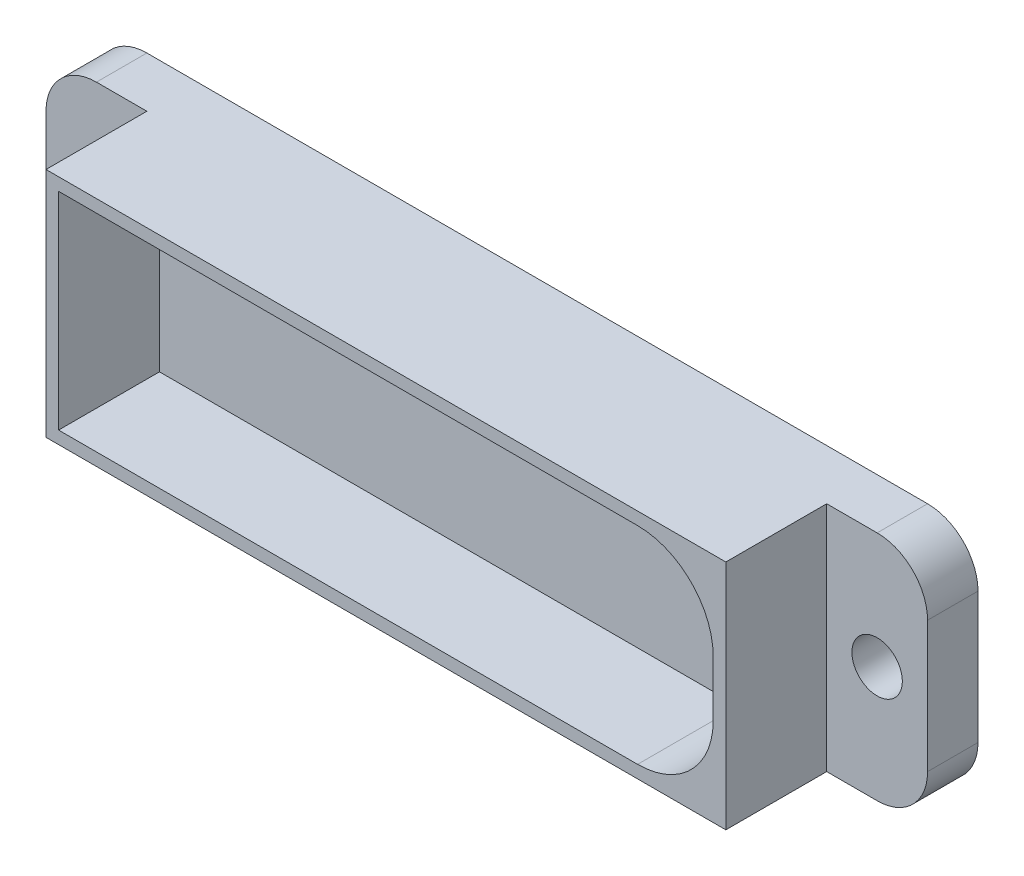
ISO-10303-21;
HEADER;
FILE_DESCRIPTION(('STEP AP214'),'2;1');
FILE_NAME('part.step','',(''),(''),'','','');
FILE_SCHEMA(('AUTOMOTIVE_DESIGN { 1 0 10303 214 1 1 1 1 }'));
ENDSEC;
DATA;
#1=APPLICATION_CONTEXT('core data for automotive mechanical design processes');
#2=APPLICATION_PROTOCOL_DEFINITION('international standard','automotive_design',2000,#1);
#3=PRODUCT_CONTEXT('',#1,'mechanical');
#4=PRODUCT('Part','Part','',(#3));
#5=PRODUCT_RELATED_PRODUCT_CATEGORY('part','',(#4));
#6=PRODUCT_DEFINITION_FORMATION('','',#4);
#7=PRODUCT_DEFINITION_CONTEXT('part definition',#1,'design');
#8=PRODUCT_DEFINITION('design','',#6,#7);
#9=PRODUCT_DEFINITION_SHAPE('','',#8);
#10=(LENGTH_UNIT() NAMED_UNIT(*) SI_UNIT(.MILLI.,.METRE.));
#11=(NAMED_UNIT(*) PLANE_ANGLE_UNIT() SI_UNIT($,.RADIAN.));
#12=(NAMED_UNIT(*) SI_UNIT($,.STERADIAN.) SOLID_ANGLE_UNIT());
#13=UNCERTAINTY_MEASURE_WITH_UNIT(LENGTH_MEASURE(1.E-05),#10,'distance_accuracy_value','');
#14=(GEOMETRIC_REPRESENTATION_CONTEXT(3) GLOBAL_UNCERTAINTY_ASSIGNED_CONTEXT((#13)) GLOBAL_UNIT_ASSIGNED_CONTEXT((#10,
#11,#12)) REPRESENTATION_CONTEXT('',''));
#15=CARTESIAN_POINT('',(0.,0.,0.));
#16=DIRECTION('',(0.,0.,1.));
#17=DIRECTION('',(1.,0.,0.));
#18=AXIS2_PLACEMENT_3D('',#15,#16,#17);
#19=CARTESIAN_POINT('',(15.48,2.6,2.));
#20=DIRECTION('',(0.,0.,-1.));
#21=DIRECTION('',(-1.,0.,0.));
#22=AXIS2_PLACEMENT_3D('',#19,#20,#21);
#23=PLANE('',#22);
#24=DIRECTION('',(0.,1.,0.));
#25=VECTOR('',#24,1.);
#26=CARTESIAN_POINT('',(13.48,2.6,2.));
#27=LINE('',#26,#25);
#28=CARTESIAN_POINT('',(13.48,-4.6,2.));
#29=VERTEX_POINT('',#28);
#30=CARTESIAN_POINT('',(13.48,4.6,2.));
#31=VERTEX_POINT('',#30);
#32=EDGE_CURVE('E226',#29,#31,#27,.T.);
#33=ORIENTED_EDGE('',*,*,#32,.F.);
#34=DIRECTION('',(1.,0.,0.));
#35=VECTOR('',#34,1.);
#36=CARTESIAN_POINT('',(-15.48,-4.6,2.));
#37=LINE('',#36,#35);
#38=CARTESIAN_POINT('',(15.48,-4.6,2.));
#39=VERTEX_POINT('',#38);
#40=EDGE_CURVE('E270',#29,#39,#37,.T.);
#41=ORIENTED_EDGE('',*,*,#40,.T.);
#42=CARTESIAN_POINT('',(15.48,-2.6,2.));
#43=DIRECTION('',(0.,0.,1.));
#44=DIRECTION('',(1.,0.,0.));
#45=AXIS2_PLACEMENT_3D('',#42,#43,#44);
#46=CIRCLE('',#45,2.);
#47=CARTESIAN_POINT('',(17.48,-2.6,2.));
#48=VERTEX_POINT('',#47);
#49=EDGE_CURVE('E273',#39,#48,#46,.T.);
#50=ORIENTED_EDGE('',*,*,#49,.T.);
#51=DIRECTION('',(0.,1.,0.));
#52=VECTOR('',#51,1.);
#53=CARTESIAN_POINT('',(17.48,-2.59999999999999,2.));
#54=LINE('',#53,#52);
#55=CARTESIAN_POINT('',(17.48,2.59999999999999,2.));
#56=VERTEX_POINT('',#55);
#57=EDGE_CURVE('E275',#48,#56,#54,.T.);
#58=ORIENTED_EDGE('',*,*,#57,.T.);
#59=CARTESIAN_POINT('',(15.48,2.6,2.));
#60=DIRECTION('',(0.,0.,1.));
#61=DIRECTION('',(-1.,0.,0.));
#62=AXIS2_PLACEMENT_3D('',#59,#60,#61);
#63=CIRCLE('',#62,2.);
#64=CARTESIAN_POINT('',(15.48,4.6,2.));
#65=VERTEX_POINT('',#64);
#66=EDGE_CURVE('E257',#56,#65,#63,.T.);
#67=ORIENTED_EDGE('',*,*,#66,.T.);
#68=DIRECTION('',(-1.,0.,0.));
#69=VECTOR('',#68,1.);
#70=CARTESIAN_POINT('',(-15.48,4.6,2.));
#71=LINE('',#70,#69);
#72=EDGE_CURVE('E262',#65,#31,#71,.T.);
#73=ORIENTED_EDGE('',*,*,#72,.T.);
#74=EDGE_LOOP('',(#33,#41,#50,#58,#67,#73));
#75=FACE_BOUND('',#74,.T.);
#76=CARTESIAN_POINT('',(15.48,0.,2.));
#77=DIRECTION('',(0.,0.,1.));
#78=DIRECTION('',(1.,0.,0.));
#79=AXIS2_PLACEMENT_3D('',#76,#77,#78);
#80=CIRCLE('',#79,1.);
#81=CARTESIAN_POINT('',(16.48,0.,2.));
#82=VERTEX_POINT('',#81);
#83=EDGE_CURVE('E245',#82,#82,#80,.T.);
#84=ORIENTED_EDGE('',*,*,#83,.F.);
#85=EDGE_LOOP('',(#84));
#86=FACE_BOUND('',#85,.T.);
#87=ADVANCED_FACE('F36',(#75,#86),#23,.F.);
#88=DIRECTION('',(0.,-1.,0.));
#89=VECTOR('',#88,1.);
#90=CARTESIAN_POINT('',(-13.48,2.6,2.));
#91=LINE('',#90,#89);
#92=CARTESIAN_POINT('',(-13.48,4.6,2.));
#93=VERTEX_POINT('',#92);
#94=CARTESIAN_POINT('',(-13.48,-4.6,2.));
#95=VERTEX_POINT('',#94);
#96=EDGE_CURVE('E59',#93,#95,#91,.T.);
#97=ORIENTED_EDGE('',*,*,#96,.F.);
#98=CARTESIAN_POINT('',(-15.48,4.6,2.));
#99=VERTEX_POINT('',#98);
#100=EDGE_CURVE('E260',#93,#99,#71,.T.);
#101=ORIENTED_EDGE('',*,*,#100,.T.);
#102=CARTESIAN_POINT('',(-15.48,2.6,2.));
#103=DIRECTION('',(0.,0.,1.));
#104=DIRECTION('',(-1.,0.,0.));
#105=AXIS2_PLACEMENT_3D('',#102,#103,#104);
#106=CIRCLE('',#105,2.);
#107=CARTESIAN_POINT('',(-17.48,2.59999999999999,2.));
#108=VERTEX_POINT('',#107);
#109=EDGE_CURVE('E264',#99,#108,#106,.T.);
#110=ORIENTED_EDGE('',*,*,#109,.T.);
#111=DIRECTION('',(0.,-1.,0.));
#112=VECTOR('',#111,1.);
#113=CARTESIAN_POINT('',(-17.48,-2.59999999999999,2.));
#114=LINE('',#113,#112);
#115=CARTESIAN_POINT('',(-17.48,-2.59999999999999,2.));
#116=VERTEX_POINT('',#115);
#117=EDGE_CURVE('E266',#108,#116,#114,.T.);
#118=ORIENTED_EDGE('',*,*,#117,.T.);
#119=CARTESIAN_POINT('',(-15.48,-2.6,2.));
#120=DIRECTION('',(0.,0.,1.));
#121=DIRECTION('',(-1.,0.,0.));
#122=AXIS2_PLACEMENT_3D('',#119,#120,#121);
#123=CIRCLE('',#122,2.);
#124=CARTESIAN_POINT('',(-15.48,-4.6,2.));
#125=VERTEX_POINT('',#124);
#126=EDGE_CURVE('E268',#116,#125,#123,.T.);
#127=ORIENTED_EDGE('',*,*,#126,.T.);
#128=EDGE_CURVE('E271',#125,#95,#37,.T.);
#129=ORIENTED_EDGE('',*,*,#128,.T.);
#130=EDGE_LOOP('',(#97,#101,#110,#118,#127,#129));
#131=FACE_BOUND('',#130,.T.);
#132=CARTESIAN_POINT('',(-15.48,0.,2.));
#133=DIRECTION('',(0.,0.,1.));
#134=DIRECTION('',(1.,0.,0.));
#135=AXIS2_PLACEMENT_3D('',#132,#133,#134);
#136=CIRCLE('',#135,1.);
#137=CARTESIAN_POINT('',(-14.48,0.,2.));
#138=VERTEX_POINT('',#137);
#139=EDGE_CURVE('E251',#138,#138,#136,.T.);
#140=ORIENTED_EDGE('',*,*,#139,.F.);
#141=EDGE_LOOP('',(#140));
#142=FACE_BOUND('',#141,.T.);
#143=ADVANCED_FACE('F333',(#131,#142),#23,.F.);
#144=CARTESIAN_POINT('',(15.48,2.6,0.));
#145=DIRECTION('',(0.,0.,-1.));
#146=DIRECTION('',(-1.,0.,0.));
#147=AXIS2_PLACEMENT_3D('',#144,#145,#146);
#148=PLANE('',#147);
#149=CARTESIAN_POINT('',(-15.48,0.,0.));
#150=DIRECTION('',(0.,0.,1.));
#151=DIRECTION('',(1.,0.,0.));
#152=AXIS2_PLACEMENT_3D('',#149,#150,#151);
#153=CIRCLE('',#152,1.);
#154=CARTESIAN_POINT('',(-14.48,0.,0.));
#155=VERTEX_POINT('',#154);
#156=EDGE_CURVE('E248',#155,#155,#153,.T.);
#157=ORIENTED_EDGE('',*,*,#156,.T.);
#158=EDGE_LOOP('',(#157));
#159=FACE_BOUND('',#158,.T.);
#160=CARTESIAN_POINT('',(-15.48,2.6,0.));
#161=DIRECTION('',(0.,0.,1.));
#162=DIRECTION('',(-1.,0.,0.));
#163=AXIS2_PLACEMENT_3D('',#160,#161,#162);
#164=CIRCLE('',#163,2.);
#165=CARTESIAN_POINT('',(-15.48,4.6,0.));
#166=VERTEX_POINT('',#165);
#167=CARTESIAN_POINT('',(-17.48,2.59999999999999,0.));
#168=VERTEX_POINT('',#167);
#169=EDGE_CURVE('E282',#166,#168,#164,.T.);
#170=ORIENTED_EDGE('',*,*,#169,.F.);
#171=DIRECTION('',(-1.,0.,0.));
#172=VECTOR('',#171,1.);
#173=CARTESIAN_POINT('',(-15.48,4.6,0.));
#174=LINE('',#173,#172);
#175=CARTESIAN_POINT('',(15.48,4.6,0.));
#176=VERTEX_POINT('',#175);
#177=EDGE_CURVE('E280',#176,#166,#174,.T.);
#178=ORIENTED_EDGE('',*,*,#177,.F.);
#179=CARTESIAN_POINT('',(15.48,2.6,0.));
#180=DIRECTION('',(0.,0.,1.));
#181=DIRECTION('',(-1.,0.,0.));
#182=AXIS2_PLACEMENT_3D('',#179,#180,#181);
#183=CIRCLE('',#182,2.);
#184=CARTESIAN_POINT('',(17.48,2.59999999999999,0.));
#185=VERTEX_POINT('',#184);
#186=EDGE_CURVE('E254',#185,#176,#183,.T.);
#187=ORIENTED_EDGE('',*,*,#186,.F.);
#188=DIRECTION('',(0.,1.,0.));
#189=VECTOR('',#188,1.);
#190=CARTESIAN_POINT('',(17.48,-2.59999999999999,0.));
#191=LINE('',#190,#189);
#192=CARTESIAN_POINT('',(17.48,-2.6,0.));
#193=VERTEX_POINT('',#192);
#194=EDGE_CURVE('E261',#193,#185,#191,.T.);
#195=ORIENTED_EDGE('',*,*,#194,.F.);
#196=CARTESIAN_POINT('',(15.48,-2.6,0.));
#197=DIRECTION('',(0.,0.,1.));
#198=DIRECTION('',(1.,0.,0.));
#199=AXIS2_PLACEMENT_3D('',#196,#197,#198);
#200=CIRCLE('',#199,2.);
#201=CARTESIAN_POINT('',(15.48,-4.6,0.));
#202=VERTEX_POINT('',#201);
#203=EDGE_CURVE('E290',#202,#193,#200,.T.);
#204=ORIENTED_EDGE('',*,*,#203,.F.);
#205=DIRECTION('',(1.,0.,0.));
#206=VECTOR('',#205,1.);
#207=CARTESIAN_POINT('',(-15.48,-4.6,0.));
#208=LINE('',#207,#206);
#209=CARTESIAN_POINT('',(-15.48,-4.6,0.));
#210=VERTEX_POINT('',#209);
#211=EDGE_CURVE('E288',#210,#202,#208,.T.);
#212=ORIENTED_EDGE('',*,*,#211,.F.);
#213=CARTESIAN_POINT('',(-15.48,-2.6,0.));
#214=DIRECTION('',(0.,0.,1.));
#215=DIRECTION('',(-1.,0.,0.));
#216=AXIS2_PLACEMENT_3D('',#213,#214,#215);
#217=CIRCLE('',#216,2.);
#218=CARTESIAN_POINT('',(-17.48,-2.59999999999999,0.));
#219=VERTEX_POINT('',#218);
#220=EDGE_CURVE('E286',#219,#210,#217,.T.);
#221=ORIENTED_EDGE('',*,*,#220,.F.);
#222=DIRECTION('',(0.,-1.,0.));
#223=VECTOR('',#222,1.);
#224=CARTESIAN_POINT('',(-17.48,-2.59999999999999,0.));
#225=LINE('',#224,#223);
#226=EDGE_CURVE('E284',#168,#219,#225,.T.);
#227=ORIENTED_EDGE('',*,*,#226,.F.);
#228=EDGE_LOOP('',(#170,#178,#187,#195,#204,#212,#221,#227));
#229=FACE_BOUND('',#228,.T.);
#230=CARTESIAN_POINT('',(15.48,0.,0.));
#231=DIRECTION('',(0.,0.,1.));
#232=DIRECTION('',(1.,0.,0.));
#233=AXIS2_PLACEMENT_3D('',#230,#231,#232);
#234=CIRCLE('',#233,1.);
#235=CARTESIAN_POINT('',(16.48,0.,0.));
#236=VERTEX_POINT('',#235);
#237=EDGE_CURVE('E244',#236,#236,#234,.T.);
#238=ORIENTED_EDGE('',*,*,#237,.T.);
#239=EDGE_LOOP('',(#238));
#240=FACE_BOUND('',#239,.T.);
#241=ADVANCED_FACE('F319',(#159,#229,#240),#148,.T.);
#242=CARTESIAN_POINT('',(15.48,2.6,2.));
#243=DIRECTION('',(0.,0.,-1.));
#244=DIRECTION('',(-1.,0.,0.));
#245=AXIS2_PLACEMENT_3D('',#242,#243,#244);
#246=CYLINDRICAL_SURFACE('',#245,2.);
#247=ORIENTED_EDGE('',*,*,#186,.T.);
#248=DIRECTION('',(0.,0.,-1.));
#249=VECTOR('',#248,1.);
#250=CARTESIAN_POINT('',(15.48,4.6,2.));
#251=LINE('',#250,#249);
#252=EDGE_CURVE('E11',#65,#176,#251,.T.);
#253=ORIENTED_EDGE('',*,*,#252,.F.);
#254=ORIENTED_EDGE('',*,*,#66,.F.);
#255=DIRECTION('',(0.,0.,-1.));
#256=VECTOR('',#255,1.);
#257=CARTESIAN_POINT('',(17.48,2.59999999999999,2.));
#258=LINE('',#257,#256);
#259=EDGE_CURVE('E277',#56,#185,#258,.T.);
#260=ORIENTED_EDGE('',*,*,#259,.T.);
#261=EDGE_LOOP('',(#247,#253,#254,#260));
#262=FACE_BOUND('',#261,.T.);
#263=ADVANCED_FACE('F38',(#262),#246,.T.);
#264=CARTESIAN_POINT('',(-15.48,4.6,2.));
#265=DIRECTION('',(0.,-1.,0.));
#266=DIRECTION('',(0.,0.,-1.));
#267=AXIS2_PLACEMENT_3D('',#264,#265,#266);
#268=PLANE('',#267);
#269=ORIENTED_EDGE('',*,*,#100,.F.);
#270=DIRECTION('',(0.,0.,-1.));
#271=VECTOR('',#270,1.);
#272=CARTESIAN_POINT('',(-13.48,4.6,6.));
#273=LINE('',#272,#271);
#274=CARTESIAN_POINT('',(-13.48,4.6,6.));
#275=VERTEX_POINT('',#274);
#276=EDGE_CURVE('E219',#275,#93,#273,.T.);
#277=ORIENTED_EDGE('',*,*,#276,.F.);
#278=DIRECTION('',(-1.,0.,0.));
#279=VECTOR('',#278,1.);
#280=CARTESIAN_POINT('',(-13.48,4.6,6.));
#281=LINE('',#280,#279);
#282=CARTESIAN_POINT('',(13.48,4.6,6.));
#283=VERTEX_POINT('',#282);
#284=EDGE_CURVE('E207',#283,#275,#281,.T.);
#285=ORIENTED_EDGE('',*,*,#284,.F.);
#286=DIRECTION('',(0.,0.,-1.));
#287=VECTOR('',#286,1.);
#288=CARTESIAN_POINT('',(13.48,4.6,6.));
#289=LINE('',#288,#287);
#290=EDGE_CURVE('E222',#283,#31,#289,.T.);
#291=ORIENTED_EDGE('',*,*,#290,.T.);
#292=ORIENTED_EDGE('',*,*,#72,.F.);
#293=ORIENTED_EDGE('',*,*,#252,.T.);
#294=ORIENTED_EDGE('',*,*,#177,.T.);
#295=DIRECTION('',(0.,0.,-1.));
#296=VECTOR('',#295,1.);
#297=CARTESIAN_POINT('',(-15.48,4.6,2.));
#298=LINE('',#297,#296);
#299=EDGE_CURVE('E44',#99,#166,#298,.T.);
#300=ORIENTED_EDGE('',*,*,#299,.F.);
#301=EDGE_LOOP('',(#269,#277,#285,#291,#292,#293,#294,#300));
#302=FACE_BOUND('',#301,.T.);
#303=ADVANCED_FACE('F336',(#302),#268,.F.);
#304=CARTESIAN_POINT('',(-15.48,2.6,2.));
#305=DIRECTION('',(0.,0.,-1.));
#306=DIRECTION('',(-1.,0.,0.));
#307=AXIS2_PLACEMENT_3D('',#304,#305,#306);
#308=CYLINDRICAL_SURFACE('',#307,2.);
#309=ORIENTED_EDGE('',*,*,#169,.T.);
#310=DIRECTION('',(0.,0.,-1.));
#311=VECTOR('',#310,1.);
#312=CARTESIAN_POINT('',(-17.48,2.59999999999999,2.));
#313=LINE('',#312,#311);
#314=EDGE_CURVE('E307',#108,#168,#313,.T.);
#315=ORIENTED_EDGE('',*,*,#314,.F.);
#316=ORIENTED_EDGE('',*,*,#109,.F.);
#317=ORIENTED_EDGE('',*,*,#299,.T.);
#318=EDGE_LOOP('',(#309,#315,#316,#317));
#319=FACE_BOUND('',#318,.T.);
#320=ADVANCED_FACE('F314',(#319),#308,.T.);
#321=CARTESIAN_POINT('',(-17.48,-2.59999999999999,2.));
#322=DIRECTION('',(1.,0.,0.));
#323=DIRECTION('',(0.,0.,-1.));
#324=AXIS2_PLACEMENT_3D('',#321,#322,#323);
#325=PLANE('',#324);
#326=ORIENTED_EDGE('',*,*,#226,.T.);
#327=DIRECTION('',(0.,0.,-1.));
#328=VECTOR('',#327,1.);
#329=CARTESIAN_POINT('',(-17.48,-2.59999999999999,2.));
#330=LINE('',#329,#328);
#331=EDGE_CURVE('E304',#116,#219,#330,.T.);
#332=ORIENTED_EDGE('',*,*,#331,.F.);
#333=ORIENTED_EDGE('',*,*,#117,.F.);
#334=ORIENTED_EDGE('',*,*,#314,.T.);
#335=EDGE_LOOP('',(#326,#332,#333,#334));
#336=FACE_BOUND('',#335,.T.);
#337=ADVANCED_FACE('F326',(#336),#325,.F.);
#338=CARTESIAN_POINT('',(-15.48,-2.6,2.));
#339=DIRECTION('',(0.,0.,-1.));
#340=DIRECTION('',(-1.,0.,0.));
#341=AXIS2_PLACEMENT_3D('',#338,#339,#340);
#342=CYLINDRICAL_SURFACE('',#341,2.);
#343=ORIENTED_EDGE('',*,*,#220,.T.);
#344=DIRECTION('',(0.,0.,-1.));
#345=VECTOR('',#344,1.);
#346=CARTESIAN_POINT('',(-15.48,-4.6,2.));
#347=LINE('',#346,#345);
#348=EDGE_CURVE('E301',#125,#210,#347,.T.);
#349=ORIENTED_EDGE('',*,*,#348,.F.);
#350=ORIENTED_EDGE('',*,*,#126,.F.);
#351=ORIENTED_EDGE('',*,*,#331,.T.);
#352=EDGE_LOOP('',(#343,#349,#350,#351));
#353=FACE_BOUND('',#352,.T.);
#354=ADVANCED_FACE('F330',(#353),#342,.T.);
#355=CARTESIAN_POINT('',(-15.48,-4.6,2.));
#356=DIRECTION('',(0.,1.,0.));
#357=DIRECTION('',(0.,0.,1.));
#358=AXIS2_PLACEMENT_3D('',#355,#356,#357);
#359=PLANE('',#358);
#360=ORIENTED_EDGE('',*,*,#211,.T.);
#361=DIRECTION('',(0.,0.,-1.));
#362=VECTOR('',#361,1.);
#363=CARTESIAN_POINT('',(15.48,-4.6,2.));
#364=LINE('',#363,#362);
#365=EDGE_CURVE('E298',#39,#202,#364,.T.);
#366=ORIENTED_EDGE('',*,*,#365,.F.);
#367=ORIENTED_EDGE('',*,*,#40,.F.);
#368=DIRECTION('',(0.,0.,-1.));
#369=VECTOR('',#368,1.);
#370=CARTESIAN_POINT('',(13.48,-4.6,6.));
#371=LINE('',#370,#369);
#372=CARTESIAN_POINT('',(13.48,-4.6,6.));
#373=VERTEX_POINT('',#372);
#374=EDGE_CURVE('E213',#373,#29,#371,.T.);
#375=ORIENTED_EDGE('',*,*,#374,.F.);
#376=DIRECTION('',(1.,0.,0.));
#377=VECTOR('',#376,1.);
#378=CARTESIAN_POINT('',(-13.48,-4.6,6.));
#379=LINE('',#378,#377);
#380=CARTESIAN_POINT('',(-13.48,-4.6,6.));
#381=VERTEX_POINT('',#380);
#382=EDGE_CURVE('E211',#381,#373,#379,.T.);
#383=ORIENTED_EDGE('',*,*,#382,.F.);
#384=DIRECTION('',(0.,0.,-1.));
#385=VECTOR('',#384,1.);
#386=CARTESIAN_POINT('',(-13.48,-4.6,6.));
#387=LINE('',#386,#385);
#388=EDGE_CURVE('E216',#381,#95,#387,.T.);
#389=ORIENTED_EDGE('',*,*,#388,.T.);
#390=ORIENTED_EDGE('',*,*,#128,.F.);
#391=ORIENTED_EDGE('',*,*,#348,.T.);
#392=EDGE_LOOP('',(#360,#366,#367,#375,#383,#389,#390,#391));
#393=FACE_BOUND('',#392,.T.);
#394=ADVANCED_FACE('F366',(#393),#359,.F.);
#395=CARTESIAN_POINT('',(15.48,-2.6,2.));
#396=DIRECTION('',(0.,0.,-1.));
#397=DIRECTION('',(-1.,0.,0.));
#398=AXIS2_PLACEMENT_3D('',#395,#396,#397);
#399=CYLINDRICAL_SURFACE('',#398,2.);
#400=ORIENTED_EDGE('',*,*,#203,.T.);
#401=DIRECTION('',(0.,0.,-1.));
#402=VECTOR('',#401,1.);
#403=CARTESIAN_POINT('',(17.48,-2.6,2.));
#404=LINE('',#403,#402);
#405=EDGE_CURVE('E295',#48,#193,#404,.T.);
#406=ORIENTED_EDGE('',*,*,#405,.F.);
#407=ORIENTED_EDGE('',*,*,#49,.F.);
#408=ORIENTED_EDGE('',*,*,#365,.T.);
#409=EDGE_LOOP('',(#400,#406,#407,#408));
#410=FACE_BOUND('',#409,.T.);
#411=ADVANCED_FACE('F364',(#410),#399,.T.);
#412=CARTESIAN_POINT('',(17.48,-2.59999999999999,2.));
#413=DIRECTION('',(-1.,0.,0.));
#414=DIRECTION('',(0.,0.,1.));
#415=AXIS2_PLACEMENT_3D('',#412,#413,#414);
#416=PLANE('',#415);
#417=ORIENTED_EDGE('',*,*,#194,.T.);
#418=ORIENTED_EDGE('',*,*,#259,.F.);
#419=ORIENTED_EDGE('',*,*,#57,.F.);
#420=ORIENTED_EDGE('',*,*,#405,.T.);
#421=EDGE_LOOP('',(#417,#418,#419,#420));
#422=FACE_BOUND('',#421,.T.);
#423=ADVANCED_FACE('F360',(#422),#416,.F.);
#424=CARTESIAN_POINT('',(-15.48,0.,2.));
#425=DIRECTION('',(0.,0.,-1.));
#426=DIRECTION('',(-1.,0.,0.));
#427=AXIS2_PLACEMENT_3D('',#424,#425,#426);
#428=CYLINDRICAL_SURFACE('',#427,1.);
#429=ORIENTED_EDGE('',*,*,#139,.T.);
#430=EDGE_LOOP('',(#429));
#431=FACE_BOUND('',#430,.T.);
#432=ORIENTED_EDGE('',*,*,#156,.F.);
#433=EDGE_LOOP('',(#432));
#434=FACE_BOUND('',#433,.T.);
#435=ADVANCED_FACE('F417',(#431,#434),#428,.F.);
#436=CARTESIAN_POINT('',(15.48,0.,2.));
#437=DIRECTION('',(0.,0.,-1.));
#438=DIRECTION('',(-1.,0.,0.));
#439=AXIS2_PLACEMENT_3D('',#436,#437,#438);
#440=CYLINDRICAL_SURFACE('',#439,1.);
#441=ORIENTED_EDGE('',*,*,#83,.T.);
#442=EDGE_LOOP('',(#441));
#443=FACE_BOUND('',#442,.T.);
#444=ORIENTED_EDGE('',*,*,#237,.F.);
#445=EDGE_LOOP('',(#444));
#446=FACE_BOUND('',#445,.T.);
#447=ADVANCED_FACE('F410',(#443,#446),#440,.F.);
#448=CARTESIAN_POINT('',(-12.98,4.1,6.));
#449=DIRECTION('',(0.,-1.,0.));
#450=DIRECTION('',(0.,0.,-1.));
#451=AXIS2_PLACEMENT_3D('',#448,#449,#450);
#452=PLANE('',#451);
#453=DIRECTION('',(-1.,0.,0.));
#454=VECTOR('',#453,1.);
#455=CARTESIAN_POINT('',(15.48,4.1,2.));
#456=LINE('',#455,#454);
#457=CARTESIAN_POINT('',(9.97999999999998,4.1,2.));
#458=VERTEX_POINT('',#457);
#459=CARTESIAN_POINT('',(-12.98,4.1,2.));
#460=VERTEX_POINT('',#459);
#461=EDGE_CURVE('E242',#458,#460,#456,.T.);
#462=ORIENTED_EDGE('',*,*,#461,.F.);
#463=DIRECTION('',(0.,0.,-1.));
#464=VECTOR('',#463,1.);
#465=CARTESIAN_POINT('',(9.97999999999998,4.1,6.));
#466=LINE('',#465,#464);
#467=CARTESIAN_POINT('',(9.97999999999998,4.1,6.));
#468=VERTEX_POINT('',#467);
#469=EDGE_CURVE('E51',#468,#458,#466,.T.);
#470=ORIENTED_EDGE('',*,*,#469,.F.);
#471=DIRECTION('',(-1.,0.,0.));
#472=VECTOR('',#471,1.);
#473=CARTESIAN_POINT('',(-12.98,4.1,6.));
#474=LINE('',#473,#472);
#475=CARTESIAN_POINT('',(-12.98,4.1,6.));
#476=VERTEX_POINT('',#475);
#477=EDGE_CURVE('E161',#468,#476,#474,.T.);
#478=ORIENTED_EDGE('',*,*,#477,.T.);
#479=DIRECTION('',(0.,0.,-1.));
#480=VECTOR('',#479,1.);
#481=CARTESIAN_POINT('',(-12.98,4.1,6.));
#482=LINE('',#481,#480);
#483=EDGE_CURVE('E164',#476,#460,#482,.T.);
#484=ORIENTED_EDGE('',*,*,#483,.T.);
#485=EDGE_LOOP('',(#462,#470,#478,#484));
#486=FACE_BOUND('',#485,.T.);
#487=ADVANCED_FACE('F163',(#486),#452,.T.);
#488=CARTESIAN_POINT('',(-12.98,4.1,6.));
#489=DIRECTION('',(1.,0.,0.));
#490=DIRECTION('',(0.,0.,-1.));
#491=AXIS2_PLACEMENT_3D('',#488,#489,#490);
#492=PLANE('',#491);
#493=DIRECTION('',(0.,-1.,0.));
#494=VECTOR('',#493,1.);
#495=CARTESIAN_POINT('',(-12.98,2.6,2.));
#496=LINE('',#495,#494);
#497=CARTESIAN_POINT('',(-12.98,-4.1,2.));
#498=VERTEX_POINT('',#497);
#499=EDGE_CURVE('E176',#460,#498,#496,.T.);
#500=ORIENTED_EDGE('',*,*,#499,.F.);
#501=ORIENTED_EDGE('',*,*,#483,.F.);
#502=DIRECTION('',(0.,-1.,0.));
#503=VECTOR('',#502,1.);
#504=CARTESIAN_POINT('',(-12.98,4.1,6.));
#505=LINE('',#504,#503);
#506=CARTESIAN_POINT('',(-12.98,-4.1,6.));
#507=VERTEX_POINT('',#506);
#508=EDGE_CURVE('E169',#476,#507,#505,.T.);
#509=ORIENTED_EDGE('',*,*,#508,.T.);
#510=DIRECTION('',(0.,0.,-1.));
#511=VECTOR('',#510,1.);
#512=CARTESIAN_POINT('',(-12.98,-4.1,6.));
#513=LINE('',#512,#511);
#514=EDGE_CURVE('E178',#507,#498,#513,.T.);
#515=ORIENTED_EDGE('',*,*,#514,.T.);
#516=EDGE_LOOP('',(#500,#501,#509,#515));
#517=FACE_BOUND('',#516,.T.);
#518=ADVANCED_FACE('F172',(#517),#492,.T.);
#519=CARTESIAN_POINT('',(-12.98,-4.1,6.));
#520=DIRECTION('',(0.,1.,0.));
#521=DIRECTION('',(-1.,0.,0.));
#522=AXIS2_PLACEMENT_3D('',#519,#520,#521);
#523=PLANE('',#522);
#524=DIRECTION('',(1.,0.,0.));
#525=VECTOR('',#524,1.);
#526=CARTESIAN_POINT('',(15.48,-4.1,2.));
#527=LINE('',#526,#525);
#528=CARTESIAN_POINT('',(9.97999999999998,-4.1,2.));
#529=VERTEX_POINT('',#528);
#530=EDGE_CURVE('E238',#498,#529,#527,.T.);
#531=ORIENTED_EDGE('',*,*,#530,.F.);
#532=ORIENTED_EDGE('',*,*,#514,.F.);
#533=DIRECTION('',(1.,0.,0.));
#534=VECTOR('',#533,1.);
#535=CARTESIAN_POINT('',(-12.98,-4.1,6.));
#536=LINE('',#535,#534);
#537=CARTESIAN_POINT('',(9.97999999999998,-4.1,6.));
#538=VERTEX_POINT('',#537);
#539=EDGE_CURVE('E183',#507,#538,#536,.T.);
#540=ORIENTED_EDGE('',*,*,#539,.T.);
#541=DIRECTION('',(0.,0.,-1.));
#542=VECTOR('',#541,1.);
#543=CARTESIAN_POINT('',(9.97999999999998,-4.1,6.));
#544=LINE('',#543,#542);
#545=EDGE_CURVE('E201',#538,#529,#544,.T.);
#546=ORIENTED_EDGE('',*,*,#545,.T.);
#547=EDGE_LOOP('',(#531,#532,#540,#546));
#548=FACE_BOUND('',#547,.T.);
#549=ADVANCED_FACE('F398',(#548),#523,.T.);
#550=CARTESIAN_POINT('',(9.98,-1.1,6.));
#551=DIRECTION('',(0.,0.,-1.));
#552=DIRECTION('',(-1.,0.,0.));
#553=AXIS2_PLACEMENT_3D('',#550,#551,#552);
#554=CYLINDRICAL_SURFACE('',#553,3.);
#555=CARTESIAN_POINT('',(9.98,-1.1,2.));
#556=DIRECTION('',(0.,0.,-1.));
#557=DIRECTION('',(-1.,0.,0.));
#558=AXIS2_PLACEMENT_3D('',#555,#556,#557);
#559=CIRCLE('',#558,3.);
#560=CARTESIAN_POINT('',(12.98,-1.1,2.));
#561=VERTEX_POINT('',#560);
#562=EDGE_CURVE('E235',#529,#561,#559,.F.);
#563=ORIENTED_EDGE('',*,*,#562,.F.);
#564=ORIENTED_EDGE('',*,*,#545,.F.);
#565=CARTESIAN_POINT('',(9.98,-1.1,6.));
#566=DIRECTION('',(0.,0.,1.));
#567=DIRECTION('',(1.,0.,0.));
#568=AXIS2_PLACEMENT_3D('',#565,#566,#567);
#569=CIRCLE('',#568,3.);
#570=CARTESIAN_POINT('',(12.98,-1.1,6.));
#571=VERTEX_POINT('',#570);
#572=EDGE_CURVE('E185',#538,#571,#569,.T.);
#573=ORIENTED_EDGE('',*,*,#572,.T.);
#574=DIRECTION('',(0.,0.,-1.));
#575=VECTOR('',#574,1.);
#576=CARTESIAN_POINT('',(12.98,-1.1,6.));
#577=LINE('',#576,#575);
#578=EDGE_CURVE('E198',#571,#561,#577,.T.);
#579=ORIENTED_EDGE('',*,*,#578,.T.);
#580=EDGE_LOOP('',(#563,#564,#573,#579));
#581=FACE_BOUND('',#580,.T.);
#582=ADVANCED_FACE('F396',(#581),#554,.F.);
#583=CARTESIAN_POINT('',(12.98,1.09999999999998,6.));
#584=DIRECTION('',(-1.,0.,0.));
#585=DIRECTION('',(0.,0.,1.));
#586=AXIS2_PLACEMENT_3D('',#583,#584,#585);
#587=PLANE('',#586);
#588=DIRECTION('',(0.,1.,0.));
#589=VECTOR('',#588,1.);
#590=CARTESIAN_POINT('',(12.98,2.6,2.));
#591=LINE('',#590,#589);
#592=CARTESIAN_POINT('',(12.98,1.09999999999998,2.));
#593=VERTEX_POINT('',#592);
#594=EDGE_CURVE('E232',#561,#593,#591,.T.);
#595=ORIENTED_EDGE('',*,*,#594,.F.);
#596=ORIENTED_EDGE('',*,*,#578,.F.);
#597=DIRECTION('',(0.,1.,0.));
#598=VECTOR('',#597,1.);
#599=CARTESIAN_POINT('',(12.98,1.09999999999998,6.));
#600=LINE('',#599,#598);
#601=CARTESIAN_POINT('',(12.98,1.1,6.));
#602=VERTEX_POINT('',#601);
#603=EDGE_CURVE('E189',#571,#602,#600,.T.);
#604=ORIENTED_EDGE('',*,*,#603,.T.);
#605=DIRECTION('',(0.,0.,-1.));
#606=VECTOR('',#605,1.);
#607=CARTESIAN_POINT('',(12.98,1.09999999999998,6.));
#608=LINE('',#607,#606);
#609=EDGE_CURVE('E195',#602,#593,#608,.T.);
#610=ORIENTED_EDGE('',*,*,#609,.T.);
#611=EDGE_LOOP('',(#595,#596,#604,#610));
#612=FACE_BOUND('',#611,.T.);
#613=ADVANCED_FACE('F391',(#612),#587,.T.);
#614=CARTESIAN_POINT('',(9.98,1.1,6.));
#615=DIRECTION('',(0.,0.,-1.));
#616=DIRECTION('',(-1.,0.,0.));
#617=AXIS2_PLACEMENT_3D('',#614,#615,#616);
#618=CYLINDRICAL_SURFACE('',#617,3.);
#619=CARTESIAN_POINT('',(9.98,1.1,2.));
#620=DIRECTION('',(0.,0.,-1.));
#621=DIRECTION('',(-1.,0.,0.));
#622=AXIS2_PLACEMENT_3D('',#619,#620,#621);
#623=CIRCLE('',#622,3.);
#624=EDGE_CURVE('E229',#593,#458,#623,.F.);
#625=ORIENTED_EDGE('',*,*,#624,.F.);
#626=ORIENTED_EDGE('',*,*,#609,.F.);
#627=CARTESIAN_POINT('',(9.98,1.1,6.));
#628=DIRECTION('',(0.,0.,1.));
#629=DIRECTION('',(1.,0.,0.));
#630=AXIS2_PLACEMENT_3D('',#627,#628,#629);
#631=CIRCLE('',#630,3.);
#632=EDGE_CURVE('E192',#602,#468,#631,.T.);
#633=ORIENTED_EDGE('',*,*,#632,.T.);
#634=ORIENTED_EDGE('',*,*,#469,.T.);
#635=EDGE_LOOP('',(#625,#626,#633,#634));
#636=FACE_BOUND('',#635,.T.);
#637=ADVANCED_FACE('F389',(#636),#618,.F.);
#638=CARTESIAN_POINT('',(13.48,4.6,6.));
#639=DIRECTION('',(-1.,0.,0.));
#640=DIRECTION('',(0.,0.,1.));
#641=AXIS2_PLACEMENT_3D('',#638,#639,#640);
#642=PLANE('',#641);
#643=ORIENTED_EDGE('',*,*,#374,.T.);
#644=ORIENTED_EDGE('',*,*,#32,.T.);
#645=ORIENTED_EDGE('',*,*,#290,.F.);
#646=DIRECTION('',(0.,1.,0.));
#647=VECTOR('',#646,1.);
#648=CARTESIAN_POINT('',(13.48,4.6,6.));
#649=LINE('',#648,#647);
#650=EDGE_CURVE('E177',#373,#283,#649,.T.);
#651=ORIENTED_EDGE('',*,*,#650,.F.);
#652=EDGE_LOOP('',(#643,#644,#645,#651));
#653=FACE_BOUND('',#652,.T.);
#654=ADVANCED_FACE('F347',(#653),#642,.F.);
#655=CARTESIAN_POINT('',(-13.48,4.6,6.));
#656=DIRECTION('',(1.,0.,0.));
#657=DIRECTION('',(0.,0.,-1.));
#658=AXIS2_PLACEMENT_3D('',#655,#656,#657);
#659=PLANE('',#658);
#660=ORIENTED_EDGE('',*,*,#276,.T.);
#661=ORIENTED_EDGE('',*,*,#96,.T.);
#662=ORIENTED_EDGE('',*,*,#388,.F.);
#663=DIRECTION('',(0.,-1.,0.));
#664=VECTOR('',#663,1.);
#665=CARTESIAN_POINT('',(-13.48,4.6,6.));
#666=LINE('',#665,#664);
#667=EDGE_CURVE('E209',#275,#381,#666,.T.);
#668=ORIENTED_EDGE('',*,*,#667,.F.);
#669=EDGE_LOOP('',(#660,#661,#662,#668));
#670=FACE_BOUND('',#669,.T.);
#671=ADVANCED_FACE('F339',(#670),#659,.F.);
#672=CARTESIAN_POINT('',(0.,0.,6.));
#673=DIRECTION('',(0.,0.,1.));
#674=DIRECTION('',(1.,0.,0.));
#675=AXIS2_PLACEMENT_3D('',#672,#673,#674);
#676=PLANE('',#675);
#677=ORIENTED_EDGE('',*,*,#650,.T.);
#678=ORIENTED_EDGE('',*,*,#284,.T.);
#679=ORIENTED_EDGE('',*,*,#667,.T.);
#680=ORIENTED_EDGE('',*,*,#382,.T.);
#681=EDGE_LOOP('',(#677,#678,#679,#680));
#682=FACE_BOUND('',#681,.T.);
#683=ORIENTED_EDGE('',*,*,#508,.F.);
#684=ORIENTED_EDGE('',*,*,#477,.F.);
#685=ORIENTED_EDGE('',*,*,#632,.F.);
#686=ORIENTED_EDGE('',*,*,#603,.F.);
#687=ORIENTED_EDGE('',*,*,#572,.F.);
#688=ORIENTED_EDGE('',*,*,#539,.F.);
#689=EDGE_LOOP('',(#683,#684,#685,#686,#687,#688));
#690=FACE_BOUND('',#689,.T.);
#691=ADVANCED_FACE('F181',(#682,#690),#676,.T.);
#692=ORIENTED_EDGE('',*,*,#624,.T.);
#693=ORIENTED_EDGE('',*,*,#461,.T.);
#694=ORIENTED_EDGE('',*,*,#499,.T.);
#695=ORIENTED_EDGE('',*,*,#530,.T.);
#696=ORIENTED_EDGE('',*,*,#562,.T.);
#697=ORIENTED_EDGE('',*,*,#594,.T.);
#698=EDGE_LOOP('',(#692,#693,#694,#695,#696,#697));
#699=FACE_BOUND('',#698,.T.);
#700=ADVANCED_FACE('F377',(#699),#23,.F.);
#701=CLOSED_SHELL('',(#87,#143,#241,#263,#303,#320,#337,#354,#394,#411,#423,#435,#447,#487,#518,
#549,#582,#613,#637,#654,#671,#691,#700));
#702=MANIFOLD_SOLID_BREP('B2',#701);
#703=ADVANCED_BREP_SHAPE_REPRESENTATION('',(#18,#702),#14);
#704=SHAPE_DEFINITION_REPRESENTATION(#9,#703);
ENDSEC;
END-ISO-10303-21;
